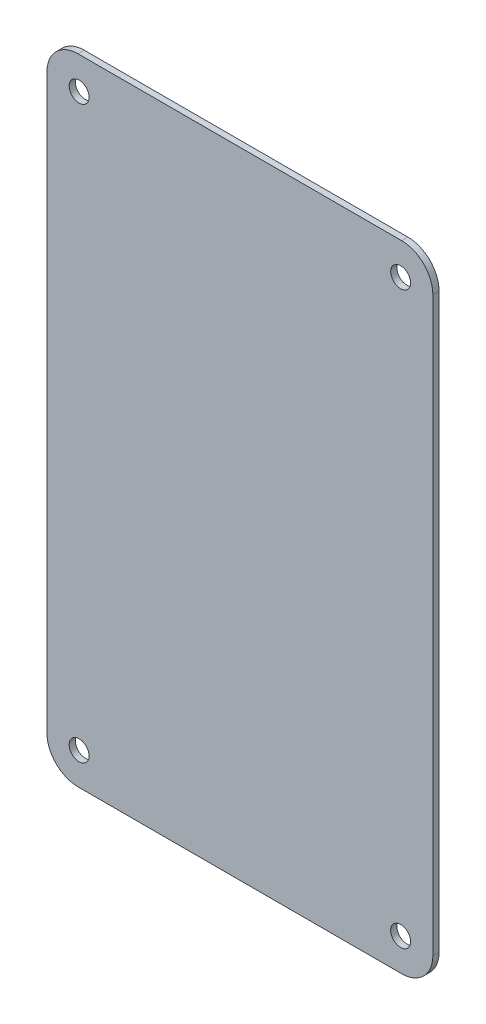
ISO-10303-21;
HEADER;
FILE_DESCRIPTION(('STEP AP214'),'2;1');
FILE_NAME('part.step','',(''),(''),'','','');
FILE_SCHEMA(('AUTOMOTIVE_DESIGN { 1 0 10303 214 1 1 1 1 }'));
ENDSEC;
DATA;
#1=APPLICATION_CONTEXT('core data for automotive mechanical design processes');
#2=APPLICATION_PROTOCOL_DEFINITION('international standard','automotive_design',2000,#1);
#3=PRODUCT_CONTEXT('',#1,'mechanical');
#4=PRODUCT('Part','Part','',(#3));
#5=PRODUCT_RELATED_PRODUCT_CATEGORY('part','',(#4));
#6=PRODUCT_DEFINITION_FORMATION('','',#4);
#7=PRODUCT_DEFINITION_CONTEXT('part definition',#1,'design');
#8=PRODUCT_DEFINITION('design','',#6,#7);
#9=PRODUCT_DEFINITION_SHAPE('','',#8);
#10=(LENGTH_UNIT() NAMED_UNIT(*) SI_UNIT(.MILLI.,.METRE.));
#11=(NAMED_UNIT(*) PLANE_ANGLE_UNIT() SI_UNIT($,.RADIAN.));
#12=(NAMED_UNIT(*) SI_UNIT($,.STERADIAN.) SOLID_ANGLE_UNIT());
#13=UNCERTAINTY_MEASURE_WITH_UNIT(LENGTH_MEASURE(1.E-05),#10,'distance_accuracy_value','');
#14=(GEOMETRIC_REPRESENTATION_CONTEXT(3) GLOBAL_UNCERTAINTY_ASSIGNED_CONTEXT((#13)) GLOBAL_UNIT_ASSIGNED_CONTEXT((#10,
#11,#12)) REPRESENTATION_CONTEXT('',''));
#15=CARTESIAN_POINT('',(0.,0.,0.));
#16=DIRECTION('',(0.,0.,1.));
#17=DIRECTION('',(1.,0.,0.));
#18=AXIS2_PLACEMENT_3D('',#15,#16,#17);
#19=CARTESIAN_POINT('',(26.971910927727,19.7073549978899,1.));
#20=DIRECTION('',(0.,0.,-1.));
#21=DIRECTION('',(-1.,0.,0.));
#22=AXIS2_PLACEMENT_3D('',#19,#20,#21);
#23=CYLINDRICAL_SURFACE('',#22,5.);
#24=CARTESIAN_POINT('',(26.971910927727,19.7073549978899,0.));
#25=DIRECTION('',(0.,0.,1.));
#26=DIRECTION('',(1.,0.,0.));
#27=AXIS2_PLACEMENT_3D('',#24,#25,#26);
#28=CIRCLE('',#27,5.);
#29=CARTESIAN_POINT('',(21.971910927727,19.7073549978899,0.));
#30=VERTEX_POINT('',#29);
#31=CARTESIAN_POINT('',(26.971910927727,14.7073549978898,0.));
#32=VERTEX_POINT('',#31);
#33=EDGE_CURVE('E129',#30,#32,#28,.T.);
#34=ORIENTED_EDGE('',*,*,#33,.T.);
#35=DIRECTION('',(0.,0.,-1.));
#36=VECTOR('',#35,1.);
#37=CARTESIAN_POINT('',(26.971910927727,14.7073549978898,1.));
#38=LINE('',#37,#36);
#39=CARTESIAN_POINT('',(26.971910927727,14.7073549978898,1.));
#40=VERTEX_POINT('',#39);
#41=EDGE_CURVE('E11',#40,#32,#38,.T.);
#42=ORIENTED_EDGE('',*,*,#41,.F.);
#43=CARTESIAN_POINT('',(26.971910927727,19.7073549978899,1.));
#44=DIRECTION('',(0.,0.,1.));
#45=DIRECTION('',(1.,0.,0.));
#46=AXIS2_PLACEMENT_3D('',#43,#44,#45);
#47=CIRCLE('',#46,5.);
#48=CARTESIAN_POINT('',(21.971910927727,19.7073549978899,1.));
#49=VERTEX_POINT('',#48);
#50=EDGE_CURVE('E144',#49,#40,#47,.T.);
#51=ORIENTED_EDGE('',*,*,#50,.F.);
#52=DIRECTION('',(0.,0.,-1.));
#53=VECTOR('',#52,1.);
#54=CARTESIAN_POINT('',(21.971910927727,19.7073549978899,1.));
#55=LINE('',#54,#53);
#56=EDGE_CURVE('E125',#49,#30,#55,.T.);
#57=ORIENTED_EDGE('',*,*,#56,.T.);
#58=EDGE_LOOP('',(#34,#42,#51,#57));
#59=FACE_BOUND('',#58,.T.);
#60=ADVANCED_FACE('F33',(#59),#23,.T.);
#61=CARTESIAN_POINT('',(26.971910927727,14.7073549978898,1.));
#62=DIRECTION('',(0.,1.,0.));
#63=DIRECTION('',(0.,0.,1.));
#64=AXIS2_PLACEMENT_3D('',#61,#62,#63);
#65=PLANE('',#64);
#66=DIRECTION('',(1.,0.,0.));
#67=VECTOR('',#66,1.);
#68=CARTESIAN_POINT('',(26.971910927727,14.7073549978898,0.));
#69=LINE('',#68,#67);
#70=CARTESIAN_POINT('',(78.971910927727,14.7073549978899,0.));
#71=VERTEX_POINT('',#70);
#72=EDGE_CURVE('E132',#32,#71,#69,.T.);
#73=ORIENTED_EDGE('',*,*,#72,.T.);
#74=DIRECTION('',(0.,0.,-1.));
#75=VECTOR('',#74,1.);
#76=CARTESIAN_POINT('',(78.971910927727,14.7073549978899,1.));
#77=LINE('',#76,#75);
#78=CARTESIAN_POINT('',(78.971910927727,14.7073549978899,1.));
#79=VERTEX_POINT('',#78);
#80=EDGE_CURVE('E41',#79,#71,#77,.T.);
#81=ORIENTED_EDGE('',*,*,#80,.F.);
#82=DIRECTION('',(1.,0.,0.));
#83=VECTOR('',#82,1.);
#84=CARTESIAN_POINT('',(26.971910927727,14.7073549978898,1.));
#85=LINE('',#84,#83);
#86=EDGE_CURVE('E92',#40,#79,#85,.T.);
#87=ORIENTED_EDGE('',*,*,#86,.F.);
#88=ORIENTED_EDGE('',*,*,#41,.T.);
#89=EDGE_LOOP('',(#73,#81,#87,#88));
#90=FACE_BOUND('',#89,.T.);
#91=ADVANCED_FACE('F220',(#90),#65,.F.);
#92=CARTESIAN_POINT('',(78.971910927727,19.7073549978898,1.));
#93=DIRECTION('',(0.,0.,-1.));
#94=DIRECTION('',(-1.,0.,0.));
#95=AXIS2_PLACEMENT_3D('',#92,#93,#94);
#96=CYLINDRICAL_SURFACE('',#95,5.);
#97=CARTESIAN_POINT('',(78.971910927727,19.7073549978898,0.));
#98=DIRECTION('',(0.,0.,1.));
#99=DIRECTION('',(1.,0.,0.));
#100=AXIS2_PLACEMENT_3D('',#97,#98,#99);
#101=CIRCLE('',#100,5.);
#102=CARTESIAN_POINT('',(83.971910927727,19.7073549978898,0.));
#103=VERTEX_POINT('',#102);
#104=EDGE_CURVE('E135',#71,#103,#101,.T.);
#105=ORIENTED_EDGE('',*,*,#104,.T.);
#106=DIRECTION('',(0.,0.,-1.));
#107=VECTOR('',#106,1.);
#108=CARTESIAN_POINT('',(83.971910927727,19.7073549978898,1.));
#109=LINE('',#108,#107);
#110=CARTESIAN_POINT('',(83.971910927727,19.7073549978898,1.));
#111=VERTEX_POINT('',#110);
#112=EDGE_CURVE('E151',#111,#103,#109,.T.);
#113=ORIENTED_EDGE('',*,*,#112,.F.);
#114=CARTESIAN_POINT('',(78.971910927727,19.7073549978898,1.));
#115=DIRECTION('',(0.,0.,1.));
#116=DIRECTION('',(1.,0.,0.));
#117=AXIS2_PLACEMENT_3D('',#114,#115,#116);
#118=CIRCLE('',#117,5.);
#119=EDGE_CURVE('E159',#79,#111,#118,.T.);
#120=ORIENTED_EDGE('',*,*,#119,.F.);
#121=ORIENTED_EDGE('',*,*,#80,.T.);
#122=EDGE_LOOP('',(#105,#113,#120,#121));
#123=FACE_BOUND('',#122,.T.);
#124=ADVANCED_FACE('F157',(#123),#96,.T.);
#125=CARTESIAN_POINT('',(83.971910927727,19.7073549978898,1.));
#126=DIRECTION('',(-1.,0.,0.));
#127=DIRECTION('',(0.,0.,1.));
#128=AXIS2_PLACEMENT_3D('',#125,#126,#127);
#129=PLANE('',#128);
#130=DIRECTION('',(0.,1.,0.));
#131=VECTOR('',#130,1.);
#132=CARTESIAN_POINT('',(83.971910927727,19.7073549978898,0.));
#133=LINE('',#132,#131);
#134=CARTESIAN_POINT('',(83.971910927727,111.70735499789,0.));
#135=VERTEX_POINT('',#134);
#136=EDGE_CURVE('E137',#103,#135,#133,.T.);
#137=ORIENTED_EDGE('',*,*,#136,.T.);
#138=DIRECTION('',(0.,0.,-1.));
#139=VECTOR('',#138,1.);
#140=CARTESIAN_POINT('',(83.971910927727,111.70735499789,1.));
#141=LINE('',#140,#139);
#142=CARTESIAN_POINT('',(83.971910927727,111.70735499789,1.));
#143=VERTEX_POINT('',#142);
#144=EDGE_CURVE('E148',#143,#135,#141,.T.);
#145=ORIENTED_EDGE('',*,*,#144,.F.);
#146=DIRECTION('',(0.,1.,0.));
#147=VECTOR('',#146,1.);
#148=CARTESIAN_POINT('',(83.971910927727,19.7073549978898,1.));
#149=LINE('',#148,#147);
#150=EDGE_CURVE('E171',#111,#143,#149,.T.);
#151=ORIENTED_EDGE('',*,*,#150,.F.);
#152=ORIENTED_EDGE('',*,*,#112,.T.);
#153=EDGE_LOOP('',(#137,#145,#151,#152));
#154=FACE_BOUND('',#153,.T.);
#155=ADVANCED_FACE('F167',(#154),#129,.F.);
#156=CARTESIAN_POINT('',(78.971910927727,111.70735499789,1.));
#157=DIRECTION('',(0.,0.,-1.));
#158=DIRECTION('',(-1.,0.,0.));
#159=AXIS2_PLACEMENT_3D('',#156,#157,#158);
#160=CYLINDRICAL_SURFACE('',#159,5.);
#161=CARTESIAN_POINT('',(78.971910927727,111.70735499789,0.));
#162=DIRECTION('',(0.,0.,1.));
#163=DIRECTION('',(1.,0.,0.));
#164=AXIS2_PLACEMENT_3D('',#161,#162,#163);
#165=CIRCLE('',#164,5.);
#166=CARTESIAN_POINT('',(78.971910927727,116.70735499789,0.));
#167=VERTEX_POINT('',#166);
#168=EDGE_CURVE('E139',#135,#167,#165,.T.);
#169=ORIENTED_EDGE('',*,*,#168,.T.);
#170=DIRECTION('',(0.,0.,-1.));
#171=VECTOR('',#170,1.);
#172=CARTESIAN_POINT('',(78.971910927727,116.70735499789,1.));
#173=LINE('',#172,#171);
#174=CARTESIAN_POINT('',(78.971910927727,116.70735499789,1.));
#175=VERTEX_POINT('',#174);
#176=EDGE_CURVE('E120',#175,#167,#173,.T.);
#177=ORIENTED_EDGE('',*,*,#176,.F.);
#178=CARTESIAN_POINT('',(78.971910927727,111.70735499789,1.));
#179=DIRECTION('',(0.,0.,1.));
#180=DIRECTION('',(1.,0.,0.));
#181=AXIS2_PLACEMENT_3D('',#178,#179,#180);
#182=CIRCLE('',#181,5.);
#183=EDGE_CURVE('E111',#143,#175,#182,.T.);
#184=ORIENTED_EDGE('',*,*,#183,.F.);
#185=ORIENTED_EDGE('',*,*,#144,.T.);
#186=EDGE_LOOP('',(#169,#177,#184,#185));
#187=FACE_BOUND('',#186,.T.);
#188=ADVANCED_FACE('F170',(#187),#160,.T.);
#189=CARTESIAN_POINT('',(78.971910927727,116.70735499789,1.));
#190=DIRECTION('',(0.,-1.,0.));
#191=DIRECTION('',(0.,0.,-1.));
#192=AXIS2_PLACEMENT_3D('',#189,#190,#191);
#193=PLANE('',#192);
#194=DIRECTION('',(-1.,0.,0.));
#195=VECTOR('',#194,1.);
#196=CARTESIAN_POINT('',(78.971910927727,116.70735499789,0.));
#197=LINE('',#196,#195);
#198=CARTESIAN_POINT('',(26.971910927727,116.70735499789,0.));
#199=VERTEX_POINT('',#198);
#200=EDGE_CURVE('E119',#167,#199,#197,.T.);
#201=ORIENTED_EDGE('',*,*,#200,.T.);
#202=DIRECTION('',(0.,0.,-1.));
#203=VECTOR('',#202,1.);
#204=CARTESIAN_POINT('',(26.971910927727,116.70735499789,1.));
#205=LINE('',#204,#203);
#206=CARTESIAN_POINT('',(26.971910927727,116.70735499789,1.));
#207=VERTEX_POINT('',#206);
#208=EDGE_CURVE('E116',#207,#199,#205,.T.);
#209=ORIENTED_EDGE('',*,*,#208,.F.);
#210=DIRECTION('',(-1.,0.,0.));
#211=VECTOR('',#210,1.);
#212=CARTESIAN_POINT('',(78.971910927727,116.70735499789,1.));
#213=LINE('',#212,#211);
#214=EDGE_CURVE('E105',#175,#207,#213,.T.);
#215=ORIENTED_EDGE('',*,*,#214,.F.);
#216=ORIENTED_EDGE('',*,*,#176,.T.);
#217=EDGE_LOOP('',(#201,#209,#215,#216));
#218=FACE_BOUND('',#217,.T.);
#219=ADVANCED_FACE('F117',(#218),#193,.F.);
#220=CARTESIAN_POINT('',(26.971910927727,111.70735499789,1.));
#221=DIRECTION('',(0.,0.,-1.));
#222=DIRECTION('',(-1.,0.,0.));
#223=AXIS2_PLACEMENT_3D('',#220,#221,#222);
#224=CYLINDRICAL_SURFACE('',#223,5.);
#225=CARTESIAN_POINT('',(26.971910927727,111.70735499789,0.));
#226=DIRECTION('',(0.,0.,1.));
#227=DIRECTION('',(1.,0.,0.));
#228=AXIS2_PLACEMENT_3D('',#225,#226,#227);
#229=CIRCLE('',#228,5.);
#230=CARTESIAN_POINT('',(21.971910927727,111.70735499789,0.));
#231=VERTEX_POINT('',#230);
#232=EDGE_CURVE('E78',#199,#231,#229,.T.);
#233=ORIENTED_EDGE('',*,*,#232,.T.);
#234=DIRECTION('',(0.,0.,-1.));
#235=VECTOR('',#234,1.);
#236=CARTESIAN_POINT('',(21.971910927727,111.70735499789,1.));
#237=LINE('',#236,#235);
#238=CARTESIAN_POINT('',(21.971910927727,111.70735499789,1.));
#239=VERTEX_POINT('',#238);
#240=EDGE_CURVE('E121',#239,#231,#237,.T.);
#241=ORIENTED_EDGE('',*,*,#240,.F.);
#242=CARTESIAN_POINT('',(26.971910927727,111.70735499789,1.));
#243=DIRECTION('',(0.,0.,1.));
#244=DIRECTION('',(1.,0.,0.));
#245=AXIS2_PLACEMENT_3D('',#242,#243,#244);
#246=CIRCLE('',#245,5.);
#247=EDGE_CURVE('E109',#207,#239,#246,.T.);
#248=ORIENTED_EDGE('',*,*,#247,.F.);
#249=ORIENTED_EDGE('',*,*,#208,.T.);
#250=EDGE_LOOP('',(#233,#241,#248,#249));
#251=FACE_BOUND('',#250,.T.);
#252=ADVANCED_FACE('F123',(#251),#224,.T.);
#253=CARTESIAN_POINT('',(21.971910927727,111.70735499789,1.));
#254=DIRECTION('',(1.,0.,0.));
#255=DIRECTION('',(0.,0.,-1.));
#256=AXIS2_PLACEMENT_3D('',#253,#254,#255);
#257=PLANE('',#256);
#258=DIRECTION('',(0.,-1.,0.));
#259=VECTOR('',#258,1.);
#260=CARTESIAN_POINT('',(21.971910927727,111.70735499789,0.));
#261=LINE('',#260,#259);
#262=EDGE_CURVE('E84',#231,#30,#261,.T.);
#263=ORIENTED_EDGE('',*,*,#262,.T.);
#264=ORIENTED_EDGE('',*,*,#56,.F.);
#265=DIRECTION('',(0.,-1.,0.));
#266=VECTOR('',#265,1.);
#267=CARTESIAN_POINT('',(21.971910927727,111.70735499789,1.));
#268=LINE('',#267,#266);
#269=EDGE_CURVE('E49',#239,#49,#268,.T.);
#270=ORIENTED_EDGE('',*,*,#269,.F.);
#271=ORIENTED_EDGE('',*,*,#240,.T.);
#272=EDGE_LOOP('',(#263,#264,#270,#271));
#273=FACE_BOUND('',#272,.T.);
#274=ADVANCED_FACE('F227',(#273),#257,.F.);
#275=CARTESIAN_POINT('',(26.971910927727,19.7073549978899,1.));
#276=DIRECTION('',(0.,0.,1.));
#277=DIRECTION('',(1.,0.,0.));
#278=AXIS2_PLACEMENT_3D('',#275,#276,#277);
#279=PLANE('',#278);
#280=CARTESIAN_POINT('',(78.8003380524733,19.8789278731436,1.));
#281=DIRECTION('',(0.,0.,1.));
#282=DIRECTION('',(1.,0.,0.));
#283=AXIS2_PLACEMENT_3D('',#280,#281,#282);
#284=CIRCLE('',#283,1.6);
#285=CARTESIAN_POINT('',(80.4003380524732,19.8789278731436,1.));
#286=VERTEX_POINT('',#285);
#287=EDGE_CURVE('E133',#286,#286,#284,.T.);
#288=ORIENTED_EDGE('',*,*,#287,.F.);
#289=EDGE_LOOP('',(#288));
#290=FACE_BOUND('',#289,.T.);
#291=CARTESIAN_POINT('',(27.1434838029808,111.535782122636,1.));
#292=DIRECTION('',(0.,0.,1.));
#293=DIRECTION('',(1.,0.,0.));
#294=AXIS2_PLACEMENT_3D('',#291,#292,#293);
#295=CIRCLE('',#294,1.6);
#296=CARTESIAN_POINT('',(28.7434838029808,111.535782122636,1.));
#297=VERTEX_POINT('',#296);
#298=EDGE_CURVE('E179',#297,#297,#295,.T.);
#299=ORIENTED_EDGE('',*,*,#298,.F.);
#300=EDGE_LOOP('',(#299));
#301=FACE_BOUND('',#300,.T.);
#302=CARTESIAN_POINT('',(78.8003380524732,111.535782122636,1.));
#303=DIRECTION('',(0.,0.,1.));
#304=DIRECTION('',(1.,0.,0.));
#305=AXIS2_PLACEMENT_3D('',#302,#303,#304);
#306=CIRCLE('',#305,1.60000000000001);
#307=CARTESIAN_POINT('',(80.4003380524732,111.535782122636,1.));
#308=VERTEX_POINT('',#307);
#309=EDGE_CURVE('E182',#308,#308,#306,.T.);
#310=ORIENTED_EDGE('',*,*,#309,.F.);
#311=EDGE_LOOP('',(#310));
#312=FACE_BOUND('',#311,.T.);
#313=CARTESIAN_POINT('',(27.1434838029808,19.8789278731436,1.));
#314=DIRECTION('',(0.,0.,1.));
#315=DIRECTION('',(1.,0.,0.));
#316=AXIS2_PLACEMENT_3D('',#313,#314,#315);
#317=CIRCLE('',#316,1.6);
#318=CARTESIAN_POINT('',(28.7434838029808,19.8789278731436,1.));
#319=VERTEX_POINT('',#318);
#320=EDGE_CURVE('E185',#319,#319,#317,.T.);
#321=ORIENTED_EDGE('',*,*,#320,.F.);
#322=EDGE_LOOP('',(#321));
#323=FACE_BOUND('',#322,.T.);
#324=ORIENTED_EDGE('',*,*,#50,.T.);
#325=ORIENTED_EDGE('',*,*,#86,.T.);
#326=ORIENTED_EDGE('',*,*,#119,.T.);
#327=ORIENTED_EDGE('',*,*,#150,.T.);
#328=ORIENTED_EDGE('',*,*,#183,.T.);
#329=ORIENTED_EDGE('',*,*,#214,.T.);
#330=ORIENTED_EDGE('',*,*,#247,.T.);
#331=ORIENTED_EDGE('',*,*,#269,.T.);
#332=EDGE_LOOP('',(#324,#325,#326,#327,#328,#329,#330,#331));
#333=FACE_BOUND('',#332,.T.);
#334=ADVANCED_FACE('F107',(#290,#301,#312,#323,#333),#279,.T.);
#335=CARTESIAN_POINT('',(26.971910927727,19.7073549978899,0.));
#336=DIRECTION('',(0.,0.,1.));
#337=DIRECTION('',(1.,0.,0.));
#338=AXIS2_PLACEMENT_3D('',#335,#336,#337);
#339=PLANE('',#338);
#340=CARTESIAN_POINT('',(78.8003380524733,19.8789278731436,0.));
#341=DIRECTION('',(0.,0.,1.));
#342=DIRECTION('',(1.,0.,0.));
#343=AXIS2_PLACEMENT_3D('',#340,#341,#342);
#344=CIRCLE('',#343,1.6);
#345=CARTESIAN_POINT('',(80.4003380524732,19.8789278731436,0.));
#346=VERTEX_POINT('',#345);
#347=EDGE_CURVE('E191',#346,#346,#344,.T.);
#348=ORIENTED_EDGE('',*,*,#347,.T.);
#349=EDGE_LOOP('',(#348));
#350=FACE_BOUND('',#349,.T.);
#351=CARTESIAN_POINT('',(27.1434838029808,111.535782122636,0.));
#352=DIRECTION('',(0.,0.,1.));
#353=DIRECTION('',(1.,0.,0.));
#354=AXIS2_PLACEMENT_3D('',#351,#352,#353);
#355=CIRCLE('',#354,1.6);
#356=CARTESIAN_POINT('',(28.7434838029808,111.535782122636,0.));
#357=VERTEX_POINT('',#356);
#358=EDGE_CURVE('E192',#357,#357,#355,.T.);
#359=ORIENTED_EDGE('',*,*,#358,.T.);
#360=EDGE_LOOP('',(#359));
#361=FACE_BOUND('',#360,.T.);
#362=CARTESIAN_POINT('',(78.8003380524732,111.535782122636,0.));
#363=DIRECTION('',(0.,0.,1.));
#364=DIRECTION('',(1.,0.,0.));
#365=AXIS2_PLACEMENT_3D('',#362,#363,#364);
#366=CIRCLE('',#365,1.60000000000001);
#367=CARTESIAN_POINT('',(80.4003380524732,111.535782122636,0.));
#368=VERTEX_POINT('',#367);
#369=EDGE_CURVE('E195',#368,#368,#366,.T.);
#370=ORIENTED_EDGE('',*,*,#369,.T.);
#371=EDGE_LOOP('',(#370));
#372=FACE_BOUND('',#371,.T.);
#373=CARTESIAN_POINT('',(27.1434838029808,19.8789278731436,0.));
#374=DIRECTION('',(0.,0.,1.));
#375=DIRECTION('',(1.,0.,0.));
#376=AXIS2_PLACEMENT_3D('',#373,#374,#375);
#377=CIRCLE('',#376,1.6);
#378=CARTESIAN_POINT('',(28.7434838029808,19.8789278731436,0.));
#379=VERTEX_POINT('',#378);
#380=EDGE_CURVE('E188',#379,#379,#377,.T.);
#381=ORIENTED_EDGE('',*,*,#380,.T.);
#382=EDGE_LOOP('',(#381));
#383=FACE_BOUND('',#382,.T.);
#384=ORIENTED_EDGE('',*,*,#33,.F.);
#385=ORIENTED_EDGE('',*,*,#262,.F.);
#386=ORIENTED_EDGE('',*,*,#232,.F.);
#387=ORIENTED_EDGE('',*,*,#200,.F.);
#388=ORIENTED_EDGE('',*,*,#168,.F.);
#389=ORIENTED_EDGE('',*,*,#136,.F.);
#390=ORIENTED_EDGE('',*,*,#104,.F.);
#391=ORIENTED_EDGE('',*,*,#72,.F.);
#392=EDGE_LOOP('',(#384,#385,#386,#387,#388,#389,#390,#391));
#393=FACE_BOUND('',#392,.T.);
#394=ADVANCED_FACE('F163',(#350,#361,#372,#383,#393),#339,.F.);
#395=CARTESIAN_POINT('',(27.1434838029808,19.8789278731436,0.));
#396=DIRECTION('',(0.,0.,1.));
#397=DIRECTION('',(1.,0.,0.));
#398=AXIS2_PLACEMENT_3D('',#395,#396,#397);
#399=CYLINDRICAL_SURFACE('',#398,1.6);
#400=ORIENTED_EDGE('',*,*,#320,.T.);
#401=EDGE_LOOP('',(#400));
#402=FACE_BOUND('',#401,.T.);
#403=ORIENTED_EDGE('',*,*,#380,.F.);
#404=EDGE_LOOP('',(#403));
#405=FACE_BOUND('',#404,.T.);
#406=ADVANCED_FACE('F206',(#402,#405),#399,.F.);
#407=CARTESIAN_POINT('',(78.8003380524732,111.535782122636,0.));
#408=DIRECTION('',(0.,0.,1.));
#409=DIRECTION('',(1.,0.,0.));
#410=AXIS2_PLACEMENT_3D('',#407,#408,#409);
#411=CYLINDRICAL_SURFACE('',#410,1.60000000000001);
#412=ORIENTED_EDGE('',*,*,#309,.T.);
#413=EDGE_LOOP('',(#412));
#414=FACE_BOUND('',#413,.T.);
#415=ORIENTED_EDGE('',*,*,#369,.F.);
#416=EDGE_LOOP('',(#415));
#417=FACE_BOUND('',#416,.T.);
#418=ADVANCED_FACE('F203',(#414,#417),#411,.F.);
#419=CARTESIAN_POINT('',(27.1434838029808,111.535782122636,0.));
#420=DIRECTION('',(0.,0.,1.));
#421=DIRECTION('',(1.,0.,0.));
#422=AXIS2_PLACEMENT_3D('',#419,#420,#421);
#423=CYLINDRICAL_SURFACE('',#422,1.6);
#424=ORIENTED_EDGE('',*,*,#298,.T.);
#425=EDGE_LOOP('',(#424));
#426=FACE_BOUND('',#425,.T.);
#427=ORIENTED_EDGE('',*,*,#358,.F.);
#428=EDGE_LOOP('',(#427));
#429=FACE_BOUND('',#428,.T.);
#430=ADVANCED_FACE('F205',(#426,#429),#423,.F.);
#431=CARTESIAN_POINT('',(78.8003380524733,19.8789278731436,0.));
#432=DIRECTION('',(0.,0.,1.));
#433=DIRECTION('',(1.,0.,0.));
#434=AXIS2_PLACEMENT_3D('',#431,#432,#433);
#435=CYLINDRICAL_SURFACE('',#434,1.6);
#436=ORIENTED_EDGE('',*,*,#287,.T.);
#437=EDGE_LOOP('',(#436));
#438=FACE_BOUND('',#437,.T.);
#439=ORIENTED_EDGE('',*,*,#347,.F.);
#440=EDGE_LOOP('',(#439));
#441=FACE_BOUND('',#440,.T.);
#442=ADVANCED_FACE('F213',(#438,#441),#435,.F.);
#443=CLOSED_SHELL('',(#60,#91,#124,#155,#188,#219,#252,#274,#334,#394,#406,#418,#430,#442));
#444=MANIFOLD_SOLID_BREP('B2',#443);
#445=ADVANCED_BREP_SHAPE_REPRESENTATION('',(#18,#444),#14);
#446=SHAPE_DEFINITION_REPRESENTATION(#9,#445);
ENDSEC;
END-ISO-10303-21;
